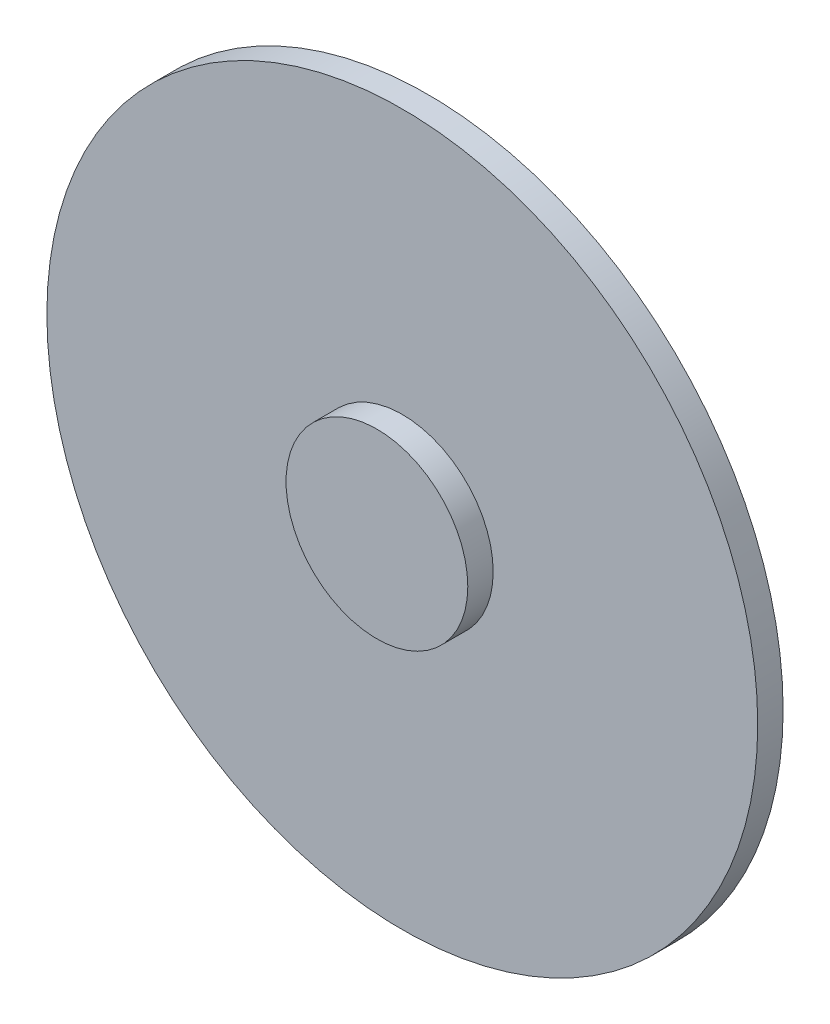
ISO-10303-21;
HEADER;
FILE_DESCRIPTION(('STEP AP214'),'2;1');
FILE_NAME('part.step','',(''),(''),'','','');
FILE_SCHEMA(('AUTOMOTIVE_DESIGN { 1 0 10303 214 1 1 1 1 }'));
ENDSEC;
DATA;
#1=APPLICATION_CONTEXT('core data for automotive mechanical design processes');
#2=APPLICATION_PROTOCOL_DEFINITION('international standard','automotive_design',2000,#1);
#3=PRODUCT_CONTEXT('',#1,'mechanical');
#4=PRODUCT('Part','Part','',(#3));
#5=PRODUCT_RELATED_PRODUCT_CATEGORY('part','',(#4));
#6=PRODUCT_DEFINITION_FORMATION('','',#4);
#7=PRODUCT_DEFINITION_CONTEXT('part definition',#1,'design');
#8=PRODUCT_DEFINITION('design','',#6,#7);
#9=PRODUCT_DEFINITION_SHAPE('','',#8);
#10=(LENGTH_UNIT() NAMED_UNIT(*) SI_UNIT(.MILLI.,.METRE.));
#11=(NAMED_UNIT(*) PLANE_ANGLE_UNIT() SI_UNIT($,.RADIAN.));
#12=(NAMED_UNIT(*) SI_UNIT($,.STERADIAN.) SOLID_ANGLE_UNIT());
#13=UNCERTAINTY_MEASURE_WITH_UNIT(LENGTH_MEASURE(1.E-05),#10,'distance_accuracy_value','');
#14=(GEOMETRIC_REPRESENTATION_CONTEXT(3) GLOBAL_UNCERTAINTY_ASSIGNED_CONTEXT((#13)) GLOBAL_UNIT_ASSIGNED_CONTEXT((#10,
#11,#12)) REPRESENTATION_CONTEXT('',''));
#15=CARTESIAN_POINT('',(0.,0.,0.));
#16=DIRECTION('',(0.,0.,1.));
#17=DIRECTION('',(1.,0.,0.));
#18=AXIS2_PLACEMENT_3D('',#15,#16,#17);
#19=CARTESIAN_POINT('',(92.2854942236277,47.625,20.33));
#20=DIRECTION('',(0.,0.,-1.));
#21=DIRECTION('',(-1.,0.,0.));
#22=AXIS2_PLACEMENT_3D('',#19,#20,#21);
#23=CYLINDRICAL_SURFACE('',#22,17.78);
#24=CARTESIAN_POINT('',(92.2854942236277,47.625,17.78));
#25=DIRECTION('',(0.,0.,-1.));
#26=DIRECTION('',(-1.,0.,0.));
#27=AXIS2_PLACEMENT_3D('',#24,#25,#26);
#28=CIRCLE('',#27,17.78);
#29=CARTESIAN_POINT('',(74.5054942236277,47.625,17.78));
#30=VERTEX_POINT('',#29);
#31=EDGE_CURVE('E53',#30,#30,#28,.T.);
#32=ORIENTED_EDGE('',*,*,#31,.F.);
#33=EDGE_LOOP('',(#32));
#34=FACE_BOUND('',#33,.T.);
#35=CARTESIAN_POINT('',(92.2854942236277,47.625,19.05));
#36=DIRECTION('',(0.,0.,1.));
#37=DIRECTION('',(1.,0.,0.));
#38=AXIS2_PLACEMENT_3D('',#35,#36,#37);
#39=CIRCLE('',#38,17.78);
#40=CARTESIAN_POINT('',(110.065494223628,47.625,19.05));
#41=VERTEX_POINT('',#40);
#42=EDGE_CURVE('E39',#41,#41,#39,.T.);
#43=ORIENTED_EDGE('',*,*,#42,.F.);
#44=EDGE_LOOP('',(#43));
#45=FACE_BOUND('',#44,.T.);
#46=ADVANCED_FACE('F35',(#34,#45),#23,.T.);
#47=CARTESIAN_POINT('',(0.,0.,17.78));
#48=DIRECTION('',(0.,0.,-1.));
#49=DIRECTION('',(-1.,0.,0.));
#50=AXIS2_PLACEMENT_3D('',#47,#48,#49);
#51=PLANE('',#50);
#52=CARTESIAN_POINT('',(92.2854942236277,47.625,17.78));
#53=DIRECTION('',(0.,0.,-1.));
#54=DIRECTION('',(-1.,0.,0.));
#55=AXIS2_PLACEMENT_3D('',#52,#53,#54);
#56=CIRCLE('',#55,12.065);
#57=CARTESIAN_POINT('',(80.2204942236277,47.625,17.78));
#58=VERTEX_POINT('',#57);
#59=EDGE_CURVE('E43',#58,#58,#56,.T.);
#60=ORIENTED_EDGE('',*,*,#59,.T.);
#61=EDGE_LOOP('',(#60));
#62=FACE_BOUND('',#61,.T.);
#63=ADVANCED_FACE('F66',(#62),#51,.T.);
#64=CARTESIAN_POINT('',(92.2854942236277,47.625,17.78));
#65=DIRECTION('',(0.,0.,-1.));
#66=DIRECTION('',(-1.,0.,0.));
#67=AXIS2_PLACEMENT_3D('',#64,#65,#66);
#68=CYLINDRICAL_SURFACE('',#67,12.065);
#69=ORIENTED_EDGE('',*,*,#59,.F.);
#70=EDGE_LOOP('',(#69));
#71=FACE_BOUND('',#70,.T.);
#72=CARTESIAN_POINT('',(92.2854942236277,47.625,16.51));
#73=DIRECTION('',(0.,0.,-1.));
#74=DIRECTION('',(-1.,0.,0.));
#75=AXIS2_PLACEMENT_3D('',#72,#73,#74);
#76=CIRCLE('',#75,12.065);
#77=CARTESIAN_POINT('',(80.2204942236277,47.625,16.51));
#78=VERTEX_POINT('',#77);
#79=EDGE_CURVE('E10',#78,#78,#76,.T.);
#80=ORIENTED_EDGE('',*,*,#79,.T.);
#81=EDGE_LOOP('',(#80));
#82=FACE_BOUND('',#81,.T.);
#83=ADVANCED_FACE('F73',(#71,#82),#68,.F.);
#84=CARTESIAN_POINT('',(92.2854942236277,47.625,16.51));
#85=DIRECTION('',(0.,0.,1.));
#86=DIRECTION('',(1.,0.,0.));
#87=AXIS2_PLACEMENT_3D('',#84,#85,#86);
#88=PLANE('',#87);
#89=ORIENTED_EDGE('',*,*,#79,.F.);
#90=EDGE_LOOP('',(#89));
#91=FACE_BOUND('',#90,.T.);
#92=CARTESIAN_POINT('',(92.2854942236277,47.625,16.51));
#93=DIRECTION('',(0.,0.,-1.));
#94=DIRECTION('',(-1.,0.,0.));
#95=AXIS2_PLACEMENT_3D('',#92,#93,#94);
#96=CIRCLE('',#95,14.605);
#97=CARTESIAN_POINT('',(77.6804942236277,47.625,16.51));
#98=VERTEX_POINT('',#97);
#99=EDGE_CURVE('E48',#98,#98,#96,.T.);
#100=ORIENTED_EDGE('',*,*,#99,.T.);
#101=EDGE_LOOP('',(#100));
#102=FACE_BOUND('',#101,.T.);
#103=ADVANCED_FACE('F93',(#91,#102),#88,.F.);
#104=CARTESIAN_POINT('',(92.2854942236277,47.625,17.78));
#105=DIRECTION('',(0.,0.,-1.));
#106=DIRECTION('',(-1.,0.,0.));
#107=AXIS2_PLACEMENT_3D('',#104,#105,#106);
#108=CYLINDRICAL_SURFACE('',#107,14.605);
#109=CARTESIAN_POINT('',(92.2854942236277,47.625,17.78));
#110=DIRECTION('',(0.,0.,-1.));
#111=DIRECTION('',(-1.,0.,0.));
#112=AXIS2_PLACEMENT_3D('',#109,#110,#111);
#113=CIRCLE('',#112,14.605);
#114=CARTESIAN_POINT('',(77.6804942236277,47.625,17.78));
#115=VERTEX_POINT('',#114);
#116=EDGE_CURVE('E51',#115,#115,#113,.T.);
#117=ORIENTED_EDGE('',*,*,#116,.T.);
#118=EDGE_LOOP('',(#117));
#119=FACE_BOUND('',#118,.T.);
#120=ORIENTED_EDGE('',*,*,#99,.F.);
#121=EDGE_LOOP('',(#120));
#122=FACE_BOUND('',#121,.T.);
#123=ADVANCED_FACE('F89',(#119,#122),#108,.T.);
#124=CARTESIAN_POINT('',(0.,0.,17.78));
#125=DIRECTION('',(0.,0.,-1.));
#126=DIRECTION('',(-1.,0.,0.));
#127=AXIS2_PLACEMENT_3D('',#124,#125,#126);
#128=PLANE('',#127);
#129=ORIENTED_EDGE('',*,*,#116,.F.);
#130=EDGE_LOOP('',(#129));
#131=FACE_BOUND('',#130,.T.);
#132=ORIENTED_EDGE('',*,*,#31,.T.);
#133=EDGE_LOOP('',(#132));
#134=FACE_BOUND('',#133,.T.);
#135=ADVANCED_FACE('F92',(#131,#134),#128,.T.);
#136=CARTESIAN_POINT('',(92.2854942236277,47.625,19.05));
#137=DIRECTION('',(0.,0.,1.));
#138=DIRECTION('',(1.,0.,0.));
#139=AXIS2_PLACEMENT_3D('',#136,#137,#138);
#140=PLANE('',#139);
#141=CARTESIAN_POINT('',(92.2854942236277,47.625,19.05));
#142=DIRECTION('',(0.,0.,1.));
#143=DIRECTION('',(1.,0.,0.));
#144=AXIS2_PLACEMENT_3D('',#141,#142,#143);
#145=CIRCLE('',#144,4.54593174784716);
#146=CARTESIAN_POINT('',(96.8314259714748,47.625,19.05));
#147=VERTEX_POINT('',#146);
#148=EDGE_CURVE('E59',#147,#147,#145,.T.);
#149=ORIENTED_EDGE('',*,*,#148,.F.);
#150=EDGE_LOOP('',(#149));
#151=FACE_BOUND('',#150,.T.);
#152=ORIENTED_EDGE('',*,*,#42,.T.);
#153=EDGE_LOOP('',(#152));
#154=FACE_BOUND('',#153,.T.);
#155=ADVANCED_FACE('F37',(#151,#154),#140,.T.);
#156=CARTESIAN_POINT('',(0.,0.,20.32));
#157=DIRECTION('',(0.,0.,1.));
#158=DIRECTION('',(1.,0.,0.));
#159=AXIS2_PLACEMENT_3D('',#156,#157,#158);
#160=PLANE('',#159);
#161=CARTESIAN_POINT('',(92.2854942236277,47.625,20.32));
#162=DIRECTION('',(0.,0.,1.));
#163=DIRECTION('',(1.,0.,0.));
#164=AXIS2_PLACEMENT_3D('',#161,#162,#163);
#165=CIRCLE('',#164,4.54593174784716);
#166=CARTESIAN_POINT('',(96.8314259714748,47.625,20.32));
#167=VERTEX_POINT('',#166);
#168=EDGE_CURVE('E55',#167,#167,#165,.T.);
#169=ORIENTED_EDGE('',*,*,#168,.T.);
#170=EDGE_LOOP('',(#169));
#171=FACE_BOUND('',#170,.T.);
#172=ADVANCED_FACE('F78',(#171),#160,.T.);
#173=CARTESIAN_POINT('',(92.2854942236277,47.625,20.32));
#174=DIRECTION('',(0.,0.,-1.));
#175=DIRECTION('',(-1.,0.,0.));
#176=AXIS2_PLACEMENT_3D('',#173,#174,#175);
#177=CYLINDRICAL_SURFACE('',#176,4.54593174784716);
#178=ORIENTED_EDGE('',*,*,#148,.T.);
#179=EDGE_LOOP('',(#178));
#180=FACE_BOUND('',#179,.T.);
#181=ORIENTED_EDGE('',*,*,#168,.F.);
#182=EDGE_LOOP('',(#181));
#183=FACE_BOUND('',#182,.T.);
#184=ADVANCED_FACE('F69',(#180,#183),#177,.T.);
#185=CLOSED_SHELL('',(#46,#63,#83,#103,#123,#135,#155,#172,#184));
#186=MANIFOLD_SOLID_BREP('B2',#185);
#187=ADVANCED_BREP_SHAPE_REPRESENTATION('',(#18,#186),#14);
#188=SHAPE_DEFINITION_REPRESENTATION(#9,#187);
ENDSEC;
END-ISO-10303-21;
